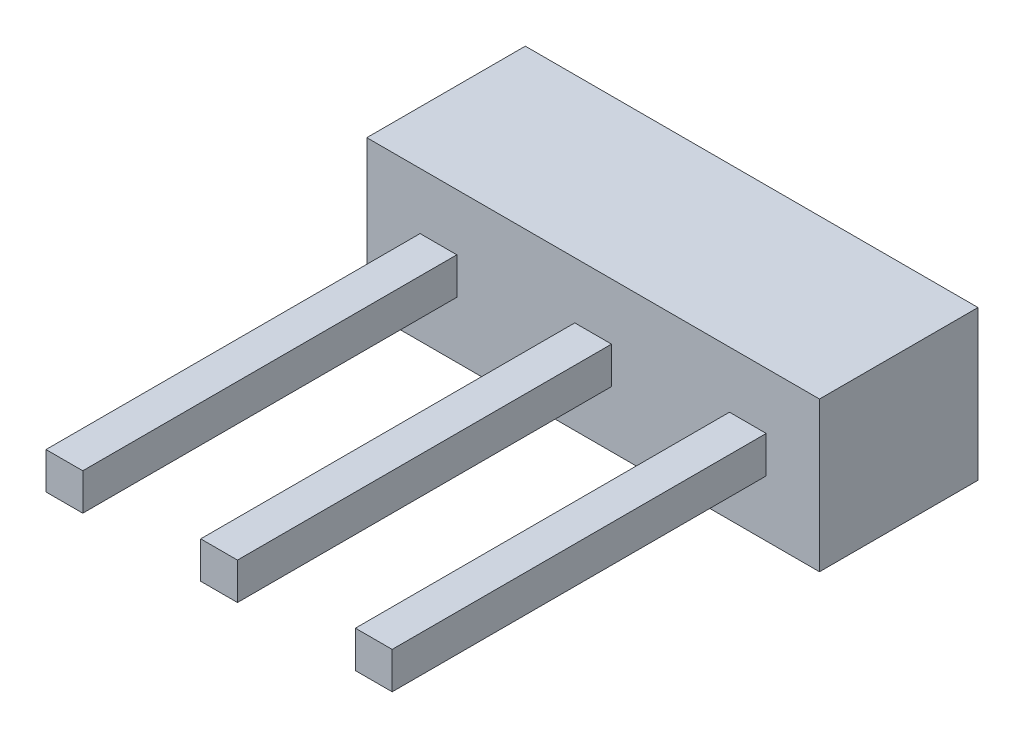
ISO-10303-21;
HEADER;
FILE_DESCRIPTION(('STEP AP214'),'2;1');
FILE_NAME('part.step','',(''),(''),'','','');
FILE_SCHEMA(('AUTOMOTIVE_DESIGN { 1 0 10303 214 1 1 1 1 }'));
ENDSEC;
DATA;
#1=APPLICATION_CONTEXT('core data for automotive mechanical design processes');
#2=APPLICATION_PROTOCOL_DEFINITION('international standard','automotive_design',2000,#1);
#3=PRODUCT_CONTEXT('',#1,'mechanical');
#4=PRODUCT('Part','Part','',(#3));
#5=PRODUCT_RELATED_PRODUCT_CATEGORY('part','',(#4));
#6=PRODUCT_DEFINITION_FORMATION('','',#4);
#7=PRODUCT_DEFINITION_CONTEXT('part definition',#1,'design');
#8=PRODUCT_DEFINITION('design','',#6,#7);
#9=PRODUCT_DEFINITION_SHAPE('','',#8);
#10=(LENGTH_UNIT() NAMED_UNIT(*) SI_UNIT(.MILLI.,.METRE.));
#11=(NAMED_UNIT(*) PLANE_ANGLE_UNIT() SI_UNIT($,.RADIAN.));
#12=(NAMED_UNIT(*) SI_UNIT($,.STERADIAN.) SOLID_ANGLE_UNIT());
#13=UNCERTAINTY_MEASURE_WITH_UNIT(LENGTH_MEASURE(1.E-05),#10,'distance_accuracy_value','');
#14=(GEOMETRIC_REPRESENTATION_CONTEXT(3) GLOBAL_UNCERTAINTY_ASSIGNED_CONTEXT((#13)) GLOBAL_UNIT_ASSIGNED_CONTEXT((#10,
#11,#12)) REPRESENTATION_CONTEXT('',''));
#15=CARTESIAN_POINT('',(0.,0.,0.));
#16=DIRECTION('',(0.,0.,1.));
#17=DIRECTION('',(1.,0.,0.));
#18=AXIS2_PLACEMENT_3D('',#15,#16,#17);
#19=CARTESIAN_POINT('',(-2.15,0.29,8.4));
#20=DIRECTION('',(0.,-1.,0.));
#21=DIRECTION('',(0.,0.,-1.));
#22=AXIS2_PLACEMENT_3D('',#19,#20,#21);
#23=PLANE('',#22);
#24=DIRECTION('',(-1.,0.,0.));
#25=VECTOR('',#24,1.);
#26=CARTESIAN_POINT('',(-2.15,0.29,2.5));
#27=LINE('',#26,#25);
#28=CARTESIAN_POINT('',(-2.15,0.29,2.5));
#29=VERTEX_POINT('',#28);
#30=CARTESIAN_POINT('',(-2.73,0.29,2.5));
#31=VERTEX_POINT('',#30);
#32=EDGE_CURVE('E11',#29,#31,#27,.T.);
#33=ORIENTED_EDGE('',*,*,#32,.T.);
#34=DIRECTION('',(0.,0.,-1.));
#35=VECTOR('',#34,1.);
#36=CARTESIAN_POINT('',(-2.73,0.29,8.4));
#37=LINE('',#36,#35);
#38=CARTESIAN_POINT('',(-2.73,0.29,8.4));
#39=VERTEX_POINT('',#38);
#40=EDGE_CURVE('E256',#39,#31,#37,.T.);
#41=ORIENTED_EDGE('',*,*,#40,.F.);
#42=DIRECTION('',(-1.,0.,0.));
#43=VECTOR('',#42,1.);
#44=CARTESIAN_POINT('',(-2.15,0.29,8.4));
#45=LINE('',#44,#43);
#46=CARTESIAN_POINT('',(-2.15,0.29,8.4));
#47=VERTEX_POINT('',#46);
#48=EDGE_CURVE('E41',#47,#39,#45,.T.);
#49=ORIENTED_EDGE('',*,*,#48,.F.);
#50=DIRECTION('',(0.,0.,-1.));
#51=VECTOR('',#50,1.);
#52=CARTESIAN_POINT('',(-2.15,0.29,8.4));
#53=LINE('',#52,#51);
#54=EDGE_CURVE('E48',#47,#29,#53,.T.);
#55=ORIENTED_EDGE('',*,*,#54,.T.);
#56=EDGE_LOOP('',(#33,#41,#49,#55));
#57=FACE_BOUND('',#56,.T.);
#58=ADVANCED_FACE('F34',(#57),#23,.F.);
#59=CARTESIAN_POINT('',(-4.88,0.,8.4));
#60=DIRECTION('',(0.,0.,-1.));
#61=DIRECTION('',(-1.,0.,0.));
#62=AXIS2_PLACEMENT_3D('',#59,#60,#61);
#63=PLANE('',#62);
#64=DIRECTION('',(0.,-1.,0.));
#65=VECTOR('',#64,1.);
#66=CARTESIAN_POINT('',(-2.73,0.29,8.4));
#67=LINE('',#66,#65);
#68=CARTESIAN_POINT('',(-2.73,-0.29,8.4));
#69=VERTEX_POINT('',#68);
#70=EDGE_CURVE('E253',#39,#69,#67,.T.);
#71=ORIENTED_EDGE('',*,*,#70,.T.);
#72=DIRECTION('',(1.,0.,0.));
#73=VECTOR('',#72,1.);
#74=CARTESIAN_POINT('',(-2.15,-0.29,8.4));
#75=LINE('',#74,#73);
#76=CARTESIAN_POINT('',(-2.15,-0.29,8.4));
#77=VERTEX_POINT('',#76);
#78=EDGE_CURVE('E244',#69,#77,#75,.T.);
#79=ORIENTED_EDGE('',*,*,#78,.T.);
#80=DIRECTION('',(0.,1.,0.));
#81=VECTOR('',#80,1.);
#82=CARTESIAN_POINT('',(-2.15,0.29,8.4));
#83=LINE('',#82,#81);
#84=EDGE_CURVE('E261',#77,#47,#83,.T.);
#85=ORIENTED_EDGE('',*,*,#84,.T.);
#86=ORIENTED_EDGE('',*,*,#48,.T.);
#87=EDGE_LOOP('',(#71,#79,#85,#86));
#88=FACE_BOUND('',#87,.T.);
#89=ADVANCED_FACE('F265',(#88),#63,.F.);
#90=CARTESIAN_POINT('',(-2.15,0.29,8.4));
#91=DIRECTION('',(-1.,0.,0.));
#92=DIRECTION('',(0.,0.,1.));
#93=AXIS2_PLACEMENT_3D('',#90,#91,#92);
#94=PLANE('',#93);
#95=DIRECTION('',(0.,1.,0.));
#96=VECTOR('',#95,1.);
#97=CARTESIAN_POINT('',(-2.15,0.29,2.5));
#98=LINE('',#97,#96);
#99=CARTESIAN_POINT('',(-2.15,-0.29,2.5));
#100=VERTEX_POINT('',#99);
#101=EDGE_CURVE('E53',#100,#29,#98,.T.);
#102=ORIENTED_EDGE('',*,*,#101,.T.);
#103=ORIENTED_EDGE('',*,*,#54,.F.);
#104=ORIENTED_EDGE('',*,*,#84,.F.);
#105=DIRECTION('',(0.,0.,-1.));
#106=VECTOR('',#105,1.);
#107=CARTESIAN_POINT('',(-2.15,-0.29,8.4));
#108=LINE('',#107,#106);
#109=EDGE_CURVE('E242',#77,#100,#108,.T.);
#110=ORIENTED_EDGE('',*,*,#109,.T.);
#111=EDGE_LOOP('',(#102,#103,#104,#110));
#112=FACE_BOUND('',#111,.T.);
#113=ADVANCED_FACE('F274',(#112),#94,.F.);
#114=CARTESIAN_POINT('',(-2.73,0.29,8.4));
#115=DIRECTION('',(1.,0.,0.));
#116=DIRECTION('',(0.,0.,-1.));
#117=AXIS2_PLACEMENT_3D('',#114,#115,#116);
#118=PLANE('',#117);
#119=DIRECTION('',(0.,-1.,0.));
#120=VECTOR('',#119,1.);
#121=CARTESIAN_POINT('',(-2.73,0.29,2.5));
#122=LINE('',#121,#120);
#123=CARTESIAN_POINT('',(-2.73,-0.29,2.5));
#124=VERTEX_POINT('',#123);
#125=EDGE_CURVE('E250',#31,#124,#122,.T.);
#126=ORIENTED_EDGE('',*,*,#125,.T.);
#127=DIRECTION('',(0.,0.,-1.));
#128=VECTOR('',#127,1.);
#129=CARTESIAN_POINT('',(-2.73,-0.29,8.4));
#130=LINE('',#129,#128);
#131=EDGE_CURVE('E247',#69,#124,#130,.T.);
#132=ORIENTED_EDGE('',*,*,#131,.F.);
#133=ORIENTED_EDGE('',*,*,#70,.F.);
#134=ORIENTED_EDGE('',*,*,#40,.T.);
#135=EDGE_LOOP('',(#126,#132,#133,#134));
#136=FACE_BOUND('',#135,.T.);
#137=ADVANCED_FACE('F270',(#136),#118,.F.);
#138=CARTESIAN_POINT('',(-2.15,-0.29,8.4));
#139=DIRECTION('',(0.,1.,0.));
#140=DIRECTION('',(0.,0.,1.));
#141=AXIS2_PLACEMENT_3D('',#138,#139,#140);
#142=PLANE('',#141);
#143=DIRECTION('',(1.,0.,0.));
#144=VECTOR('',#143,1.);
#145=CARTESIAN_POINT('',(-2.15,-0.29,2.5));
#146=LINE('',#145,#144);
#147=EDGE_CURVE('E240',#124,#100,#146,.T.);
#148=ORIENTED_EDGE('',*,*,#147,.T.);
#149=ORIENTED_EDGE('',*,*,#109,.F.);
#150=ORIENTED_EDGE('',*,*,#78,.F.);
#151=ORIENTED_EDGE('',*,*,#131,.T.);
#152=EDGE_LOOP('',(#148,#149,#150,#151));
#153=FACE_BOUND('',#152,.T.);
#154=ADVANCED_FACE('F273',(#153),#142,.F.);
#155=CARTESIAN_POINT('',(0.289999999999999,0.29,8.4));
#156=DIRECTION('',(0.,-1.,0.));
#157=DIRECTION('',(0.,0.,-1.));
#158=AXIS2_PLACEMENT_3D('',#155,#156,#157);
#159=PLANE('',#158);
#160=DIRECTION('',(-1.,0.,0.));
#161=VECTOR('',#160,1.);
#162=CARTESIAN_POINT('',(0.289999999999999,0.29,2.5));
#163=LINE('',#162,#161);
#164=CARTESIAN_POINT('',(0.289999999999999,0.29,2.5));
#165=VERTEX_POINT('',#164);
#166=CARTESIAN_POINT('',(-0.290000000000001,0.29,2.5));
#167=VERTEX_POINT('',#166);
#168=EDGE_CURVE('E237',#165,#167,#163,.T.);
#169=ORIENTED_EDGE('',*,*,#168,.T.);
#170=DIRECTION('',(0.,0.,-1.));
#171=VECTOR('',#170,1.);
#172=CARTESIAN_POINT('',(-0.290000000000001,0.29,8.4));
#173=LINE('',#172,#171);
#174=CARTESIAN_POINT('',(-0.290000000000001,0.29,8.4));
#175=VERTEX_POINT('',#174);
#176=EDGE_CURVE('E223',#175,#167,#173,.T.);
#177=ORIENTED_EDGE('',*,*,#176,.F.);
#178=DIRECTION('',(-1.,0.,0.));
#179=VECTOR('',#178,1.);
#180=CARTESIAN_POINT('',(0.289999999999999,0.29,8.4));
#181=LINE('',#180,#179);
#182=CARTESIAN_POINT('',(0.289999999999999,0.29,8.4));
#183=VERTEX_POINT('',#182);
#184=EDGE_CURVE('E234',#183,#175,#181,.T.);
#185=ORIENTED_EDGE('',*,*,#184,.F.);
#186=DIRECTION('',(0.,0.,-1.));
#187=VECTOR('',#186,1.);
#188=CARTESIAN_POINT('',(0.289999999999999,0.29,8.4));
#189=LINE('',#188,#187);
#190=EDGE_CURVE('E228',#183,#165,#189,.T.);
#191=ORIENTED_EDGE('',*,*,#190,.T.);
#192=EDGE_LOOP('',(#169,#177,#185,#191));
#193=FACE_BOUND('',#192,.T.);
#194=ADVANCED_FACE('F326',(#193),#159,.F.);
#195=CARTESIAN_POINT('',(-2.44,0.,8.4));
#196=DIRECTION('',(0.,0.,-1.));
#197=DIRECTION('',(-1.,0.,0.));
#198=AXIS2_PLACEMENT_3D('',#195,#196,#197);
#199=PLANE('',#198);
#200=DIRECTION('',(0.,-1.,0.));
#201=VECTOR('',#200,1.);
#202=CARTESIAN_POINT('',(-0.290000000000001,0.29,8.4));
#203=LINE('',#202,#201);
#204=CARTESIAN_POINT('',(-0.290000000000001,-0.29,8.4));
#205=VERTEX_POINT('',#204);
#206=EDGE_CURVE('E220',#175,#205,#203,.T.);
#207=ORIENTED_EDGE('',*,*,#206,.T.);
#208=DIRECTION('',(1.,0.,0.));
#209=VECTOR('',#208,1.);
#210=CARTESIAN_POINT('',(0.289999999999999,-0.29,8.4));
#211=LINE('',#210,#209);
#212=CARTESIAN_POINT('',(0.289999999999999,-0.29,8.4));
#213=VERTEX_POINT('',#212);
#214=EDGE_CURVE('E211',#205,#213,#211,.T.);
#215=ORIENTED_EDGE('',*,*,#214,.T.);
#216=DIRECTION('',(0.,1.,0.));
#217=VECTOR('',#216,1.);
#218=CARTESIAN_POINT('',(0.289999999999999,0.29,8.4));
#219=LINE('',#218,#217);
#220=EDGE_CURVE('E231',#213,#183,#219,.T.);
#221=ORIENTED_EDGE('',*,*,#220,.T.);
#222=ORIENTED_EDGE('',*,*,#184,.T.);
#223=EDGE_LOOP('',(#207,#215,#221,#222));
#224=FACE_BOUND('',#223,.T.);
#225=ADVANCED_FACE('F329',(#224),#199,.F.);
#226=CARTESIAN_POINT('',(0.289999999999999,0.29,8.4));
#227=DIRECTION('',(-1.,0.,0.));
#228=DIRECTION('',(0.,0.,1.));
#229=AXIS2_PLACEMENT_3D('',#226,#227,#228);
#230=PLANE('',#229);
#231=DIRECTION('',(0.,1.,0.));
#232=VECTOR('',#231,1.);
#233=CARTESIAN_POINT('',(0.289999999999999,0.29,2.5));
#234=LINE('',#233,#232);
#235=CARTESIAN_POINT('',(0.289999999999999,-0.29,2.5));
#236=VERTEX_POINT('',#235);
#237=EDGE_CURVE('E226',#236,#165,#234,.T.);
#238=ORIENTED_EDGE('',*,*,#237,.T.);
#239=ORIENTED_EDGE('',*,*,#190,.F.);
#240=ORIENTED_EDGE('',*,*,#220,.F.);
#241=DIRECTION('',(0.,0.,-1.));
#242=VECTOR('',#241,1.);
#243=CARTESIAN_POINT('',(0.289999999999999,-0.29,8.4));
#244=LINE('',#243,#242);
#245=EDGE_CURVE('E208',#213,#236,#244,.T.);
#246=ORIENTED_EDGE('',*,*,#245,.T.);
#247=EDGE_LOOP('',(#238,#239,#240,#246));
#248=FACE_BOUND('',#247,.T.);
#249=ADVANCED_FACE('F333',(#248),#230,.F.);
#250=CARTESIAN_POINT('',(-0.290000000000001,0.29,8.4));
#251=DIRECTION('',(1.,0.,0.));
#252=DIRECTION('',(0.,0.,-1.));
#253=AXIS2_PLACEMENT_3D('',#250,#251,#252);
#254=PLANE('',#253);
#255=DIRECTION('',(0.,-1.,0.));
#256=VECTOR('',#255,1.);
#257=CARTESIAN_POINT('',(-0.290000000000001,0.29,2.5));
#258=LINE('',#257,#256);
#259=CARTESIAN_POINT('',(-0.290000000000001,-0.29,2.5));
#260=VERTEX_POINT('',#259);
#261=EDGE_CURVE('E217',#167,#260,#258,.T.);
#262=ORIENTED_EDGE('',*,*,#261,.T.);
#263=DIRECTION('',(0.,0.,-1.));
#264=VECTOR('',#263,1.);
#265=CARTESIAN_POINT('',(-0.290000000000001,-0.29,8.4));
#266=LINE('',#265,#264);
#267=EDGE_CURVE('E214',#205,#260,#266,.T.);
#268=ORIENTED_EDGE('',*,*,#267,.F.);
#269=ORIENTED_EDGE('',*,*,#206,.F.);
#270=ORIENTED_EDGE('',*,*,#176,.T.);
#271=EDGE_LOOP('',(#262,#268,#269,#270));
#272=FACE_BOUND('',#271,.T.);
#273=ADVANCED_FACE('F337',(#272),#254,.F.);
#274=CARTESIAN_POINT('',(0.289999999999999,-0.29,8.4));
#275=DIRECTION('',(0.,1.,0.));
#276=DIRECTION('',(0.,0.,1.));
#277=AXIS2_PLACEMENT_3D('',#274,#275,#276);
#278=PLANE('',#277);
#279=DIRECTION('',(1.,0.,0.));
#280=VECTOR('',#279,1.);
#281=CARTESIAN_POINT('',(0.289999999999999,-0.29,2.5));
#282=LINE('',#281,#280);
#283=EDGE_CURVE('E206',#260,#236,#282,.T.);
#284=ORIENTED_EDGE('',*,*,#283,.T.);
#285=ORIENTED_EDGE('',*,*,#245,.F.);
#286=ORIENTED_EDGE('',*,*,#214,.F.);
#287=ORIENTED_EDGE('',*,*,#267,.T.);
#288=EDGE_LOOP('',(#284,#285,#286,#287));
#289=FACE_BOUND('',#288,.T.);
#290=ADVANCED_FACE('F280',(#289),#278,.F.);
#291=CARTESIAN_POINT('',(0.,0.,2.5));
#292=DIRECTION('',(0.,0.,-1.));
#293=DIRECTION('',(-1.,0.,0.));
#294=AXIS2_PLACEMENT_3D('',#291,#292,#293);
#295=PLANE('',#294);
#296=ORIENTED_EDGE('',*,*,#125,.F.);
#297=ORIENTED_EDGE('',*,*,#32,.F.);
#298=ORIENTED_EDGE('',*,*,#101,.F.);
#299=ORIENTED_EDGE('',*,*,#147,.F.);
#300=EDGE_LOOP('',(#296,#297,#298,#299));
#301=FACE_BOUND('',#300,.T.);
#302=ORIENTED_EDGE('',*,*,#261,.F.);
#303=ORIENTED_EDGE('',*,*,#168,.F.);
#304=ORIENTED_EDGE('',*,*,#237,.F.);
#305=ORIENTED_EDGE('',*,*,#283,.F.);
#306=EDGE_LOOP('',(#302,#303,#304,#305));
#307=FACE_BOUND('',#306,.T.);
#308=DIRECTION('',(0.,1.,0.));
#309=VECTOR('',#308,1.);
#310=CARTESIAN_POINT('',(3.57,-1.18,2.5));
#311=LINE('',#310,#309);
#312=CARTESIAN_POINT('',(3.57,-1.18,2.5));
#313=VERTEX_POINT('',#312);
#314=CARTESIAN_POINT('',(3.57,1.18,2.5));
#315=VERTEX_POINT('',#314);
#316=EDGE_CURVE('E180',#313,#315,#311,.T.);
#317=ORIENTED_EDGE('',*,*,#316,.T.);
#318=DIRECTION('',(-1.,0.,0.));
#319=VECTOR('',#318,1.);
#320=CARTESIAN_POINT('',(-3.57,1.18,2.5));
#321=LINE('',#320,#319);
#322=CARTESIAN_POINT('',(-3.57,1.18,2.5));
#323=VERTEX_POINT('',#322);
#324=EDGE_CURVE('E183',#315,#323,#321,.T.);
#325=ORIENTED_EDGE('',*,*,#324,.T.);
#326=DIRECTION('',(0.,-1.,0.));
#327=VECTOR('',#326,1.);
#328=CARTESIAN_POINT('',(-3.57,-1.18,2.5));
#329=LINE('',#328,#327);
#330=CARTESIAN_POINT('',(-3.57,-1.18,2.5));
#331=VERTEX_POINT('',#330);
#332=EDGE_CURVE('E186',#323,#331,#329,.T.);
#333=ORIENTED_EDGE('',*,*,#332,.T.);
#334=DIRECTION('',(1.,0.,0.));
#335=VECTOR('',#334,1.);
#336=CARTESIAN_POINT('',(-3.57,-1.18,2.5));
#337=LINE('',#336,#335);
#338=EDGE_CURVE('E188',#331,#313,#337,.T.);
#339=ORIENTED_EDGE('',*,*,#338,.T.);
#340=EDGE_LOOP('',(#317,#325,#333,#339));
#341=FACE_BOUND('',#340,.T.);
#342=DIRECTION('',(0.,-1.,0.));
#343=VECTOR('',#342,1.);
#344=CARTESIAN_POINT('',(2.15,0.29,2.5));
#345=LINE('',#344,#343);
#346=CARTESIAN_POINT('',(2.15,0.29,2.5));
#347=VERTEX_POINT('',#346);
#348=CARTESIAN_POINT('',(2.15,-0.29,2.5));
#349=VERTEX_POINT('',#348);
#350=EDGE_CURVE('E170',#347,#349,#345,.T.);
#351=ORIENTED_EDGE('',*,*,#350,.F.);
#352=DIRECTION('',(-1.,0.,0.));
#353=VECTOR('',#352,1.);
#354=CARTESIAN_POINT('',(2.73,0.29,2.5));
#355=LINE('',#354,#353);
#356=CARTESIAN_POINT('',(2.73,0.29,2.5));
#357=VERTEX_POINT('',#356);
#358=EDGE_CURVE('E167',#357,#347,#355,.T.);
#359=ORIENTED_EDGE('',*,*,#358,.F.);
#360=DIRECTION('',(0.,1.,0.));
#361=VECTOR('',#360,1.);
#362=CARTESIAN_POINT('',(2.73,0.29,2.5));
#363=LINE('',#362,#361);
#364=CARTESIAN_POINT('',(2.73,-0.29,2.5));
#365=VERTEX_POINT('',#364);
#366=EDGE_CURVE('E296',#365,#357,#363,.T.);
#367=ORIENTED_EDGE('',*,*,#366,.F.);
#368=DIRECTION('',(1.,0.,0.));
#369=VECTOR('',#368,1.);
#370=CARTESIAN_POINT('',(2.73,-0.29,2.5));
#371=LINE('',#370,#369);
#372=EDGE_CURVE('E289',#349,#365,#371,.T.);
#373=ORIENTED_EDGE('',*,*,#372,.F.);
#374=EDGE_LOOP('',(#351,#359,#367,#373));
#375=FACE_BOUND('',#374,.T.);
#376=ADVANCED_FACE('F276',(#301,#307,#341,#375),#295,.F.);
#377=CARTESIAN_POINT('',(3.57,-1.18,2.5));
#378=DIRECTION('',(-1.,0.,0.));
#379=DIRECTION('',(0.,0.,1.));
#380=AXIS2_PLACEMENT_3D('',#377,#378,#379);
#381=PLANE('',#380);
#382=DIRECTION('',(0.,1.,0.));
#383=VECTOR('',#382,1.);
#384=CARTESIAN_POINT('',(3.57,-1.18,0.));
#385=LINE('',#384,#383);
#386=CARTESIAN_POINT('',(3.57,-1.18,0.));
#387=VERTEX_POINT('',#386);
#388=CARTESIAN_POINT('',(3.57,1.18,0.));
#389=VERTEX_POINT('',#388);
#390=EDGE_CURVE('E171',#387,#389,#385,.T.);
#391=ORIENTED_EDGE('',*,*,#390,.T.);
#392=DIRECTION('',(0.,0.,-1.));
#393=VECTOR('',#392,1.);
#394=CARTESIAN_POINT('',(3.57,1.18,2.5));
#395=LINE('',#394,#393);
#396=EDGE_CURVE('E203',#315,#389,#395,.T.);
#397=ORIENTED_EDGE('',*,*,#396,.F.);
#398=ORIENTED_EDGE('',*,*,#316,.F.);
#399=DIRECTION('',(0.,0.,-1.));
#400=VECTOR('',#399,1.);
#401=CARTESIAN_POINT('',(3.57,-1.18,2.5));
#402=LINE('',#401,#400);
#403=EDGE_CURVE('E189',#313,#387,#402,.T.);
#404=ORIENTED_EDGE('',*,*,#403,.T.);
#405=EDGE_LOOP('',(#391,#397,#398,#404));
#406=FACE_BOUND('',#405,.T.);
#407=ADVANCED_FACE('F279',(#406),#381,.F.);
#408=CARTESIAN_POINT('',(-3.57,1.18,2.5));
#409=DIRECTION('',(0.,-1.,0.));
#410=DIRECTION('',(0.,0.,-1.));
#411=AXIS2_PLACEMENT_3D('',#408,#409,#410);
#412=PLANE('',#411);
#413=DIRECTION('',(-1.,0.,0.));
#414=VECTOR('',#413,1.);
#415=CARTESIAN_POINT('',(-3.57,1.18,0.));
#416=LINE('',#415,#414);
#417=CARTESIAN_POINT('',(-3.57,1.18,0.));
#418=VERTEX_POINT('',#417);
#419=EDGE_CURVE('E174',#389,#418,#416,.T.);
#420=ORIENTED_EDGE('',*,*,#419,.T.);
#421=DIRECTION('',(0.,0.,-1.));
#422=VECTOR('',#421,1.);
#423=CARTESIAN_POINT('',(-3.57,1.18,2.5));
#424=LINE('',#423,#422);
#425=EDGE_CURVE('E200',#323,#418,#424,.T.);
#426=ORIENTED_EDGE('',*,*,#425,.F.);
#427=ORIENTED_EDGE('',*,*,#324,.F.);
#428=ORIENTED_EDGE('',*,*,#396,.T.);
#429=EDGE_LOOP('',(#420,#426,#427,#428));
#430=FACE_BOUND('',#429,.T.);
#431=ADVANCED_FACE('F347',(#430),#412,.F.);
#432=CARTESIAN_POINT('',(-3.57,-1.18,2.5));
#433=DIRECTION('',(1.,0.,0.));
#434=DIRECTION('',(0.,0.,-1.));
#435=AXIS2_PLACEMENT_3D('',#432,#433,#434);
#436=PLANE('',#435);
#437=DIRECTION('',(0.,-1.,0.));
#438=VECTOR('',#437,1.);
#439=CARTESIAN_POINT('',(-3.57,-1.18,0.));
#440=LINE('',#439,#438);
#441=CARTESIAN_POINT('',(-3.57,-1.18,0.));
#442=VERTEX_POINT('',#441);
#443=EDGE_CURVE('E192',#418,#442,#440,.T.);
#444=ORIENTED_EDGE('',*,*,#443,.T.);
#445=DIRECTION('',(0.,0.,-1.));
#446=VECTOR('',#445,1.);
#447=CARTESIAN_POINT('',(-3.57,-1.18,2.5));
#448=LINE('',#447,#446);
#449=EDGE_CURVE('E197',#331,#442,#448,.T.);
#450=ORIENTED_EDGE('',*,*,#449,.F.);
#451=ORIENTED_EDGE('',*,*,#332,.F.);
#452=ORIENTED_EDGE('',*,*,#425,.T.);
#453=EDGE_LOOP('',(#444,#450,#451,#452));
#454=FACE_BOUND('',#453,.T.);
#455=ADVANCED_FACE('F351',(#454),#436,.F.);
#456=CARTESIAN_POINT('',(-3.57,-1.18,2.5));
#457=DIRECTION('',(0.,1.,0.));
#458=DIRECTION('',(0.,0.,1.));
#459=AXIS2_PLACEMENT_3D('',#456,#457,#458);
#460=PLANE('',#459);
#461=DIRECTION('',(1.,0.,0.));
#462=VECTOR('',#461,1.);
#463=CARTESIAN_POINT('',(-3.57,-1.18,0.));
#464=LINE('',#463,#462);
#465=EDGE_CURVE('E184',#442,#387,#464,.T.);
#466=ORIENTED_EDGE('',*,*,#465,.T.);
#467=ORIENTED_EDGE('',*,*,#403,.F.);
#468=ORIENTED_EDGE('',*,*,#338,.F.);
#469=ORIENTED_EDGE('',*,*,#449,.T.);
#470=EDGE_LOOP('',(#466,#467,#468,#469));
#471=FACE_BOUND('',#470,.T.);
#472=ADVANCED_FACE('F355',(#471),#460,.F.);
#473=CARTESIAN_POINT('',(0.,0.,0.));
#474=DIRECTION('',(0.,0.,-1.));
#475=DIRECTION('',(-1.,0.,0.));
#476=AXIS2_PLACEMENT_3D('',#473,#474,#475);
#477=PLANE('',#476);
#478=ORIENTED_EDGE('',*,*,#390,.F.);
#479=ORIENTED_EDGE('',*,*,#465,.F.);
#480=ORIENTED_EDGE('',*,*,#443,.F.);
#481=ORIENTED_EDGE('',*,*,#419,.F.);
#482=EDGE_LOOP('',(#478,#479,#480,#481));
#483=FACE_BOUND('',#482,.T.);
#484=ADVANCED_FACE('F359',(#483),#477,.T.);
#485=CARTESIAN_POINT('',(2.15,0.29,8.4));
#486=DIRECTION('',(1.,0.,0.));
#487=DIRECTION('',(0.,0.,-1.));
#488=AXIS2_PLACEMENT_3D('',#485,#486,#487);
#489=PLANE('',#488);
#490=ORIENTED_EDGE('',*,*,#350,.T.);
#491=DIRECTION('',(0.,0.,-1.));
#492=VECTOR('',#491,1.);
#493=CARTESIAN_POINT('',(2.15,-0.29,8.4));
#494=LINE('',#493,#492);
#495=CARTESIAN_POINT('',(2.15,-0.29,8.4));
#496=VERTEX_POINT('',#495);
#497=EDGE_CURVE('E151',#496,#349,#494,.T.);
#498=ORIENTED_EDGE('',*,*,#497,.F.);
#499=DIRECTION('',(0.,-1.,0.));
#500=VECTOR('',#499,1.);
#501=CARTESIAN_POINT('',(2.15,0.29,8.4));
#502=LINE('',#501,#500);
#503=CARTESIAN_POINT('',(2.15,0.29,8.4));
#504=VERTEX_POINT('',#503);
#505=EDGE_CURVE('E158',#504,#496,#502,.T.);
#506=ORIENTED_EDGE('',*,*,#505,.F.);
#507=DIRECTION('',(0.,0.,-1.));
#508=VECTOR('',#507,1.);
#509=CARTESIAN_POINT('',(2.15,0.29,8.4));
#510=LINE('',#509,#508);
#511=EDGE_CURVE('E294',#504,#347,#510,.T.);
#512=ORIENTED_EDGE('',*,*,#511,.T.);
#513=EDGE_LOOP('',(#490,#498,#506,#512));
#514=FACE_BOUND('',#513,.T.);
#515=ADVANCED_FACE('F169',(#514),#489,.F.);
#516=CARTESIAN_POINT('',(2.73,-0.29,8.4));
#517=DIRECTION('',(0.,1.,0.));
#518=DIRECTION('',(0.,0.,1.));
#519=AXIS2_PLACEMENT_3D('',#516,#517,#518);
#520=PLANE('',#519);
#521=ORIENTED_EDGE('',*,*,#372,.T.);
#522=DIRECTION('',(0.,0.,-1.));
#523=VECTOR('',#522,1.);
#524=CARTESIAN_POINT('',(2.73,-0.29,8.4));
#525=LINE('',#524,#523);
#526=CARTESIAN_POINT('',(2.73,-0.29,8.4));
#527=VERTEX_POINT('',#526);
#528=EDGE_CURVE('E154',#527,#365,#525,.T.);
#529=ORIENTED_EDGE('',*,*,#528,.F.);
#530=DIRECTION('',(1.,0.,0.));
#531=VECTOR('',#530,1.);
#532=CARTESIAN_POINT('',(2.73,-0.29,8.4));
#533=LINE('',#532,#531);
#534=EDGE_CURVE('E146',#496,#527,#533,.T.);
#535=ORIENTED_EDGE('',*,*,#534,.F.);
#536=ORIENTED_EDGE('',*,*,#497,.T.);
#537=EDGE_LOOP('',(#521,#529,#535,#536));
#538=FACE_BOUND('',#537,.T.);
#539=ADVANCED_FACE('F149',(#538),#520,.F.);
#540=CARTESIAN_POINT('',(2.73,0.29,8.4));
#541=DIRECTION('',(-1.,0.,0.));
#542=DIRECTION('',(0.,0.,1.));
#543=AXIS2_PLACEMENT_3D('',#540,#541,#542);
#544=PLANE('',#543);
#545=ORIENTED_EDGE('',*,*,#366,.T.);
#546=DIRECTION('',(0.,0.,-1.));
#547=VECTOR('',#546,1.);
#548=CARTESIAN_POINT('',(2.73,0.29,8.4));
#549=LINE('',#548,#547);
#550=CARTESIAN_POINT('',(2.73,0.29,8.4));
#551=VERTEX_POINT('',#550);
#552=EDGE_CURVE('E176',#551,#357,#549,.T.);
#553=ORIENTED_EDGE('',*,*,#552,.F.);
#554=DIRECTION('',(0.,1.,0.));
#555=VECTOR('',#554,1.);
#556=CARTESIAN_POINT('',(2.73,0.29,8.4));
#557=LINE('',#556,#555);
#558=EDGE_CURVE('E157',#527,#551,#557,.T.);
#559=ORIENTED_EDGE('',*,*,#558,.F.);
#560=ORIENTED_EDGE('',*,*,#528,.T.);
#561=EDGE_LOOP('',(#545,#553,#559,#560));
#562=FACE_BOUND('',#561,.T.);
#563=ADVANCED_FACE('F304',(#562),#544,.F.);
#564=CARTESIAN_POINT('',(2.73,0.29,8.4));
#565=DIRECTION('',(0.,-1.,0.));
#566=DIRECTION('',(0.,0.,-1.));
#567=AXIS2_PLACEMENT_3D('',#564,#565,#566);
#568=PLANE('',#567);
#569=ORIENTED_EDGE('',*,*,#358,.T.);
#570=ORIENTED_EDGE('',*,*,#511,.F.);
#571=DIRECTION('',(-1.,0.,0.));
#572=VECTOR('',#571,1.);
#573=CARTESIAN_POINT('',(2.73,0.29,8.4));
#574=LINE('',#573,#572);
#575=EDGE_CURVE('E163',#551,#504,#574,.T.);
#576=ORIENTED_EDGE('',*,*,#575,.F.);
#577=ORIENTED_EDGE('',*,*,#552,.T.);
#578=EDGE_LOOP('',(#569,#570,#576,#577));
#579=FACE_BOUND('',#578,.T.);
#580=ADVANCED_FACE('F293',(#579),#568,.F.);
#581=CARTESIAN_POINT('',(0.,0.,8.4));
#582=DIRECTION('',(0.,0.,-1.));
#583=DIRECTION('',(-1.,0.,0.));
#584=AXIS2_PLACEMENT_3D('',#581,#582,#583);
#585=PLANE('',#584);
#586=ORIENTED_EDGE('',*,*,#505,.T.);
#587=ORIENTED_EDGE('',*,*,#534,.T.);
#588=ORIENTED_EDGE('',*,*,#558,.T.);
#589=ORIENTED_EDGE('',*,*,#575,.T.);
#590=EDGE_LOOP('',(#586,#587,#588,#589));
#591=FACE_BOUND('',#590,.T.);
#592=ADVANCED_FACE('F161',(#591),#585,.F.);
#593=CLOSED_SHELL('',(#58,#89,#113,#137,#154,#194,#225,#249,#273,#290,#376,#407,#431,#455,#472,
#484,#515,#539,#563,#580,#592));
#594=MANIFOLD_SOLID_BREP('B2',#593);
#595=ADVANCED_BREP_SHAPE_REPRESENTATION('',(#18,#594),#14);
#596=SHAPE_DEFINITION_REPRESENTATION(#9,#595);
ENDSEC;
END-ISO-10303-21;
